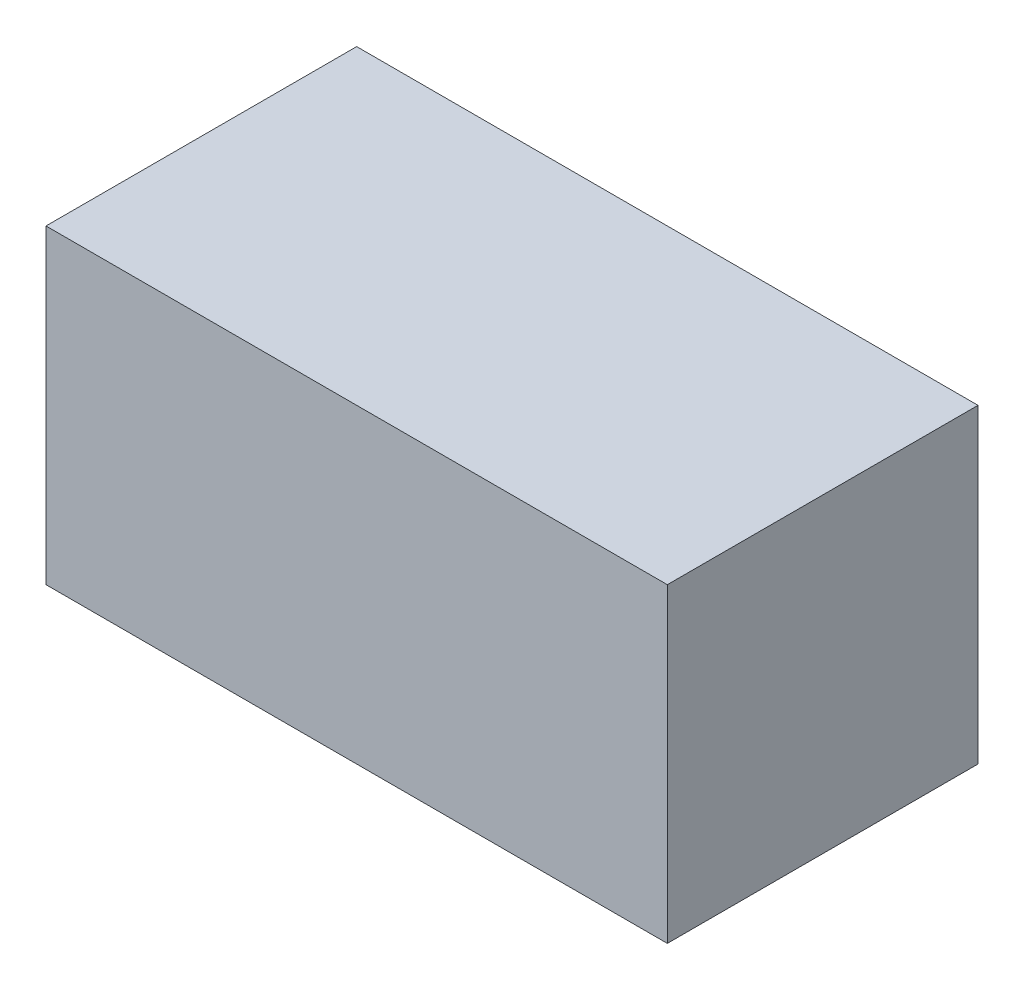
ISO-10303-21;
HEADER;
FILE_DESCRIPTION(('STEP AP214'),'2;1');
FILE_NAME('part.step','',(''),(''),'','','');
FILE_SCHEMA(('AUTOMOTIVE_DESIGN { 1 0 10303 214 1 1 1 1 }'));
ENDSEC;
DATA;
#1=APPLICATION_CONTEXT('core data for automotive mechanical design processes');
#2=APPLICATION_PROTOCOL_DEFINITION('international standard','automotive_design',2000,#1);
#3=PRODUCT_CONTEXT('',#1,'mechanical');
#4=PRODUCT('Part','Part','',(#3));
#5=PRODUCT_RELATED_PRODUCT_CATEGORY('part','',(#4));
#6=PRODUCT_DEFINITION_FORMATION('','',#4);
#7=PRODUCT_DEFINITION_CONTEXT('part definition',#1,'design');
#8=PRODUCT_DEFINITION('design','',#6,#7);
#9=PRODUCT_DEFINITION_SHAPE('','',#8);
#10=(LENGTH_UNIT() NAMED_UNIT(*) SI_UNIT(.MILLI.,.METRE.));
#11=(NAMED_UNIT(*) PLANE_ANGLE_UNIT() SI_UNIT($,.RADIAN.));
#12=(NAMED_UNIT(*) SI_UNIT($,.STERADIAN.) SOLID_ANGLE_UNIT());
#13=UNCERTAINTY_MEASURE_WITH_UNIT(LENGTH_MEASURE(1.E-05),#10,'distance_accuracy_value','');
#14=(GEOMETRIC_REPRESENTATION_CONTEXT(3) GLOBAL_UNCERTAINTY_ASSIGNED_CONTEXT((#13)) GLOBAL_UNIT_ASSIGNED_CONTEXT((#10,
#11,#12)) REPRESENTATION_CONTEXT('',''));
#15=CARTESIAN_POINT('',(0.,0.,0.));
#16=DIRECTION('',(0.,0.,1.));
#17=DIRECTION('',(1.,0.,0.));
#18=AXIS2_PLACEMENT_3D('',#15,#16,#17);
#19=CARTESIAN_POINT('',(0.,20.,0.));
#20=DIRECTION('',(1.,0.,0.));
#21=DIRECTION('',(0.,0.,-1.));
#22=AXIS2_PLACEMENT_3D('',#19,#20,#21);
#23=PLANE('',#22);
#24=DIRECTION('',(0.,0.,1.));
#25=VECTOR('',#24,1.);
#26=CARTESIAN_POINT('',(0.,0.,0.));
#27=LINE('',#26,#25);
#28=CARTESIAN_POINT('',(0.,0.,0.));
#29=VERTEX_POINT('',#28);
#30=CARTESIAN_POINT('',(0.,0.,20.));
#31=VERTEX_POINT('',#30);
#32=EDGE_CURVE('E107',#29,#31,#27,.T.);
#33=ORIENTED_EDGE('',*,*,#32,.T.);
#34=DIRECTION('',(0.,-1.,0.));
#35=VECTOR('',#34,1.);
#36=CARTESIAN_POINT('',(0.,20.,20.));
#37=LINE('',#36,#35);
#38=CARTESIAN_POINT('',(0.,20.,20.));
#39=VERTEX_POINT('',#38);
#40=EDGE_CURVE('E11',#39,#31,#37,.T.);
#41=ORIENTED_EDGE('',*,*,#40,.F.);
#42=DIRECTION('',(0.,0.,1.));
#43=VECTOR('',#42,1.);
#44=CARTESIAN_POINT('',(0.,20.,0.));
#45=LINE('',#44,#43);
#46=CARTESIAN_POINT('',(0.,20.,0.));
#47=VERTEX_POINT('',#46);
#48=EDGE_CURVE('E91',#47,#39,#45,.T.);
#49=ORIENTED_EDGE('',*,*,#48,.F.);
#50=DIRECTION('',(0.,-1.,0.));
#51=VECTOR('',#50,1.);
#52=CARTESIAN_POINT('',(0.,20.,0.));
#53=LINE('',#52,#51);
#54=EDGE_CURVE('E103',#47,#29,#53,.T.);
#55=ORIENTED_EDGE('',*,*,#54,.T.);
#56=EDGE_LOOP('',(#33,#41,#49,#55));
#57=FACE_BOUND('',#56,.T.);
#58=ADVANCED_FACE('F39',(#57),#23,.F.);
#59=CARTESIAN_POINT('',(0.,20.,20.));
#60=DIRECTION('',(0.,0.,-1.));
#61=DIRECTION('',(-1.,0.,0.));
#62=AXIS2_PLACEMENT_3D('',#59,#60,#61);
#63=PLANE('',#62);
#64=DIRECTION('',(1.,0.,0.));
#65=VECTOR('',#64,1.);
#66=CARTESIAN_POINT('',(0.,0.,20.));
#67=LINE('',#66,#65);
#68=CARTESIAN_POINT('',(40.,0.,20.));
#69=VERTEX_POINT('',#68);
#70=EDGE_CURVE('E96',#31,#69,#67,.T.);
#71=ORIENTED_EDGE('',*,*,#70,.T.);
#72=DIRECTION('',(0.,-1.,0.));
#73=VECTOR('',#72,1.);
#74=CARTESIAN_POINT('',(40.,20.,20.));
#75=LINE('',#74,#73);
#76=CARTESIAN_POINT('',(40.,20.,20.));
#77=VERTEX_POINT('',#76);
#78=EDGE_CURVE('E48',#77,#69,#75,.T.);
#79=ORIENTED_EDGE('',*,*,#78,.F.);
#80=DIRECTION('',(1.,0.,0.));
#81=VECTOR('',#80,1.);
#82=CARTESIAN_POINT('',(0.,20.,20.));
#83=LINE('',#82,#81);
#84=EDGE_CURVE('E86',#39,#77,#83,.T.);
#85=ORIENTED_EDGE('',*,*,#84,.F.);
#86=ORIENTED_EDGE('',*,*,#40,.T.);
#87=EDGE_LOOP('',(#71,#79,#85,#86));
#88=FACE_BOUND('',#87,.T.);
#89=ADVANCED_FACE('F95',(#88),#63,.F.);
#90=CARTESIAN_POINT('',(40.,20.,0.));
#91=DIRECTION('',(-1.,0.,0.));
#92=DIRECTION('',(0.,0.,1.));
#93=AXIS2_PLACEMENT_3D('',#90,#91,#92);
#94=PLANE('',#93);
#95=DIRECTION('',(0.,0.,-1.));
#96=VECTOR('',#95,1.);
#97=CARTESIAN_POINT('',(40.,0.,0.));
#98=LINE('',#97,#96);
#99=CARTESIAN_POINT('',(40.,0.,0.));
#100=VERTEX_POINT('',#99);
#101=EDGE_CURVE('E73',#69,#100,#98,.T.);
#102=ORIENTED_EDGE('',*,*,#101,.T.);
#103=DIRECTION('',(0.,-1.,0.));
#104=VECTOR('',#103,1.);
#105=CARTESIAN_POINT('',(40.,20.,0.));
#106=LINE('',#105,#104);
#107=CARTESIAN_POINT('',(40.,20.,0.));
#108=VERTEX_POINT('',#107);
#109=EDGE_CURVE('E98',#108,#100,#106,.T.);
#110=ORIENTED_EDGE('',*,*,#109,.F.);
#111=DIRECTION('',(0.,0.,-1.));
#112=VECTOR('',#111,1.);
#113=CARTESIAN_POINT('',(40.,20.,0.));
#114=LINE('',#113,#112);
#115=EDGE_CURVE('E89',#77,#108,#114,.T.);
#116=ORIENTED_EDGE('',*,*,#115,.F.);
#117=ORIENTED_EDGE('',*,*,#78,.T.);
#118=EDGE_LOOP('',(#102,#110,#116,#117));
#119=FACE_BOUND('',#118,.T.);
#120=ADVANCED_FACE('F99',(#119),#94,.F.);
#121=CARTESIAN_POINT('',(0.,20.,0.));
#122=DIRECTION('',(0.,0.,1.));
#123=DIRECTION('',(1.,0.,0.));
#124=AXIS2_PLACEMENT_3D('',#121,#122,#123);
#125=PLANE('',#124);
#126=DIRECTION('',(-1.,0.,0.));
#127=VECTOR('',#126,1.);
#128=CARTESIAN_POINT('',(0.,0.,0.));
#129=LINE('',#128,#127);
#130=EDGE_CURVE('E79',#100,#29,#129,.T.);
#131=ORIENTED_EDGE('',*,*,#130,.T.);
#132=ORIENTED_EDGE('',*,*,#54,.F.);
#133=DIRECTION('',(-1.,0.,0.));
#134=VECTOR('',#133,1.);
#135=CARTESIAN_POINT('',(0.,20.,0.));
#136=LINE('',#135,#134);
#137=EDGE_CURVE('E56',#108,#47,#136,.T.);
#138=ORIENTED_EDGE('',*,*,#137,.F.);
#139=ORIENTED_EDGE('',*,*,#109,.T.);
#140=EDGE_LOOP('',(#131,#132,#138,#139));
#141=FACE_BOUND('',#140,.T.);
#142=ADVANCED_FACE('F120',(#141),#125,.F.);
#143=CARTESIAN_POINT('',(0.,20.,0.));
#144=DIRECTION('',(0.,1.,0.));
#145=DIRECTION('',(0.,0.,1.));
#146=AXIS2_PLACEMENT_3D('',#143,#144,#145);
#147=PLANE('',#146);
#148=ORIENTED_EDGE('',*,*,#48,.T.);
#149=ORIENTED_EDGE('',*,*,#84,.T.);
#150=ORIENTED_EDGE('',*,*,#115,.T.);
#151=ORIENTED_EDGE('',*,*,#137,.T.);
#152=EDGE_LOOP('',(#148,#149,#150,#151));
#153=FACE_BOUND('',#152,.T.);
#154=ADVANCED_FACE('F87',(#153),#147,.T.);
#155=CARTESIAN_POINT('',(0.,0.,0.));
#156=DIRECTION('',(0.,1.,0.));
#157=DIRECTION('',(0.,0.,1.));
#158=AXIS2_PLACEMENT_3D('',#155,#156,#157);
#159=PLANE('',#158);
#160=ORIENTED_EDGE('',*,*,#32,.F.);
#161=ORIENTED_EDGE('',*,*,#130,.F.);
#162=ORIENTED_EDGE('',*,*,#101,.F.);
#163=ORIENTED_EDGE('',*,*,#70,.F.);
#164=EDGE_LOOP('',(#160,#161,#162,#163));
#165=FACE_BOUND('',#164,.T.);
#166=ADVANCED_FACE('F123',(#165),#159,.F.);
#167=CLOSED_SHELL('',(#58,#89,#120,#142,#154,#166));
#168=MANIFOLD_SOLID_BREP('B2',#167);
#169=ADVANCED_BREP_SHAPE_REPRESENTATION('',(#18,#168),#14);
#170=SHAPE_DEFINITION_REPRESENTATION(#9,#169);
ENDSEC;
END-ISO-10303-21;
